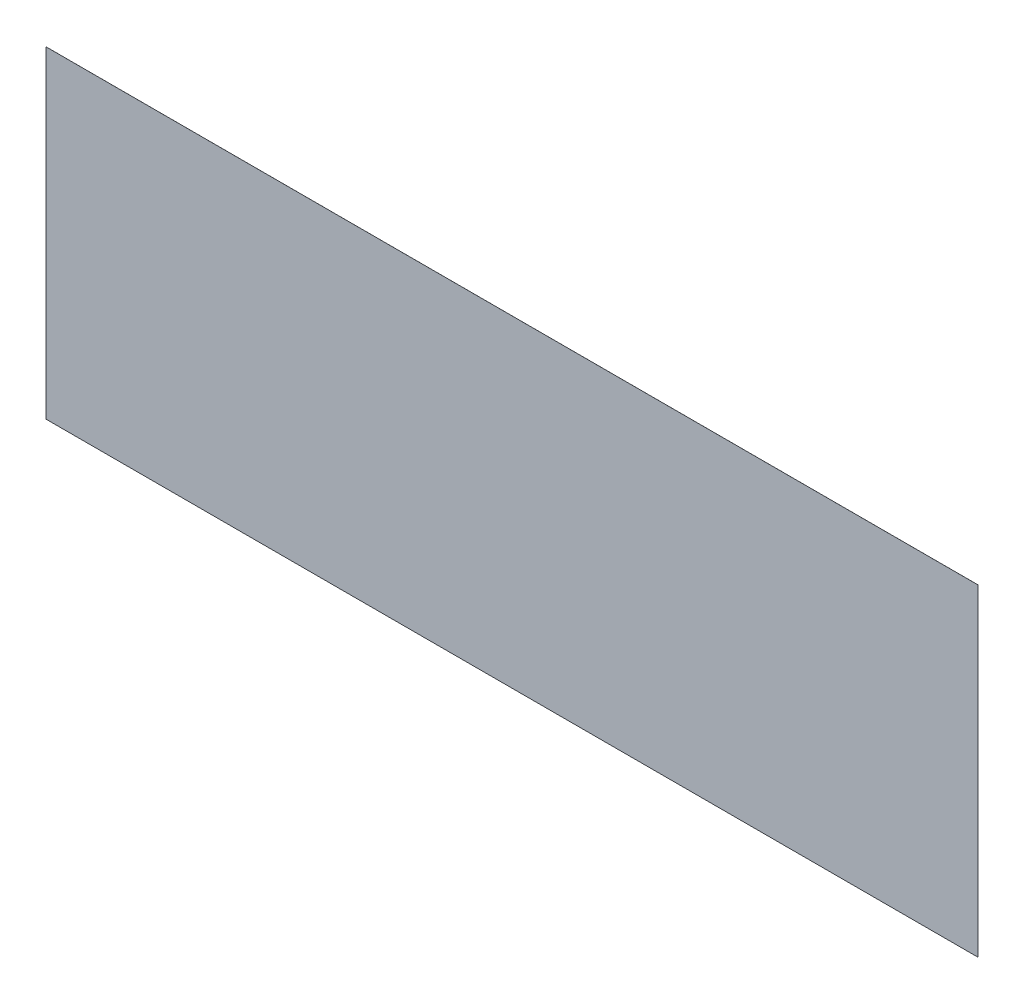
ISO-10303-21;
HEADER;
FILE_DESCRIPTION(('STEP AP214'),'2;1');
FILE_NAME('part.step','',(''),(''),'','','');
FILE_SCHEMA(('AUTOMOTIVE_DESIGN { 1 0 10303 214 1 1 1 1 }'));
ENDSEC;
DATA;
#1=APPLICATION_CONTEXT('core data for automotive mechanical design processes');
#2=APPLICATION_PROTOCOL_DEFINITION('international standard','automotive_design',2000,#1);
#3=PRODUCT_CONTEXT('',#1,'mechanical');
#4=PRODUCT('Part','Part','',(#3));
#5=PRODUCT_RELATED_PRODUCT_CATEGORY('part','',(#4));
#6=PRODUCT_DEFINITION_FORMATION('','',#4);
#7=PRODUCT_DEFINITION_CONTEXT('part definition',#1,'design');
#8=PRODUCT_DEFINITION('design','',#6,#7);
#9=PRODUCT_DEFINITION_SHAPE('','',#8);
#10=(LENGTH_UNIT() NAMED_UNIT(*) SI_UNIT(.MILLI.,.METRE.));
#11=(NAMED_UNIT(*) PLANE_ANGLE_UNIT() SI_UNIT($,.RADIAN.));
#12=(NAMED_UNIT(*) SI_UNIT($,.STERADIAN.) SOLID_ANGLE_UNIT());
#13=UNCERTAINTY_MEASURE_WITH_UNIT(LENGTH_MEASURE(1.E-05),#10,'distance_accuracy_value','');
#14=(GEOMETRIC_REPRESENTATION_CONTEXT(3) GLOBAL_UNCERTAINTY_ASSIGNED_CONTEXT((#13)) GLOBAL_UNIT_ASSIGNED_CONTEXT((#10,
#11,#12)) REPRESENTATION_CONTEXT('',''));
#15=CARTESIAN_POINT('',(0.,0.,0.));
#16=DIRECTION('',(0.,0.,1.));
#17=DIRECTION('',(1.,0.,0.));
#18=AXIS2_PLACEMENT_3D('',#15,#16,#17);
#19=CARTESIAN_POINT('',(0.,0.,0.1));
#20=DIRECTION('',(1.,0.,0.));
#21=DIRECTION('',(0.,1.,0.));
#22=AXIS2_PLACEMENT_3D('',#19,#20,#21);
#23=PLANE('',#22);
#24=DIRECTION('',(0.,-1.,0.));
#25=VECTOR('',#24,1.);
#26=CARTESIAN_POINT('',(0.,0.,0.));
#27=LINE('',#26,#25);
#28=CARTESIAN_POINT('',(0.,0.,0.));
#29=VERTEX_POINT('',#28);
#30=CARTESIAN_POINT('',(1.22464679914735E-13,-1000.,0.));
#31=VERTEX_POINT('',#30);
#32=EDGE_CURVE('E107',#29,#31,#27,.T.);
#33=ORIENTED_EDGE('',*,*,#32,.T.);
#34=DIRECTION('',(0.,0.,-1.));
#35=VECTOR('',#34,1.);
#36=CARTESIAN_POINT('',(1.22464679914735E-13,-1000.,0.1));
#37=LINE('',#36,#35);
#38=CARTESIAN_POINT('',(1.22464679914735E-13,-1000.,0.1));
#39=VERTEX_POINT('',#38);
#40=EDGE_CURVE('E11',#39,#31,#37,.T.);
#41=ORIENTED_EDGE('',*,*,#40,.F.);
#42=DIRECTION('',(0.,-1.,0.));
#43=VECTOR('',#42,1.);
#44=CARTESIAN_POINT('',(0.,0.,0.1));
#45=LINE('',#44,#43);
#46=CARTESIAN_POINT('',(0.,0.,0.1));
#47=VERTEX_POINT('',#46);
#48=EDGE_CURVE('E91',#47,#39,#45,.T.);
#49=ORIENTED_EDGE('',*,*,#48,.F.);
#50=DIRECTION('',(0.,0.,-1.));
#51=VECTOR('',#50,1.);
#52=CARTESIAN_POINT('',(0.,0.,0.1));
#53=LINE('',#52,#51);
#54=EDGE_CURVE('E103',#47,#29,#53,.T.);
#55=ORIENTED_EDGE('',*,*,#54,.T.);
#56=EDGE_LOOP('',(#33,#41,#49,#55));
#57=FACE_BOUND('',#56,.T.);
#58=ADVANCED_FACE('F39',(#57),#23,.F.);
#59=CARTESIAN_POINT('',(1.22464679914735E-13,-1000.,0.1));
#60=DIRECTION('',(0.,1.,0.));
#61=DIRECTION('',(0.,0.,1.));
#62=AXIS2_PLACEMENT_3D('',#59,#60,#61);
#63=PLANE('',#62);
#64=DIRECTION('',(1.,0.,0.));
#65=VECTOR('',#64,1.);
#66=CARTESIAN_POINT('',(1.22464679914735E-13,-1000.,0.));
#67=LINE('',#66,#65);
#68=CARTESIAN_POINT('',(2890.,-1000.,0.));
#69=VERTEX_POINT('',#68);
#70=EDGE_CURVE('E96',#31,#69,#67,.T.);
#71=ORIENTED_EDGE('',*,*,#70,.T.);
#72=DIRECTION('',(0.,0.,-1.));
#73=VECTOR('',#72,1.);
#74=CARTESIAN_POINT('',(2890.,-1000.,0.1));
#75=LINE('',#74,#73);
#76=CARTESIAN_POINT('',(2890.,-1000.,0.1));
#77=VERTEX_POINT('',#76);
#78=EDGE_CURVE('E48',#77,#69,#75,.T.);
#79=ORIENTED_EDGE('',*,*,#78,.F.);
#80=DIRECTION('',(1.,0.,0.));
#81=VECTOR('',#80,1.);
#82=CARTESIAN_POINT('',(1.22464679914735E-13,-1000.,0.1));
#83=LINE('',#82,#81);
#84=EDGE_CURVE('E86',#39,#77,#83,.T.);
#85=ORIENTED_EDGE('',*,*,#84,.F.);
#86=ORIENTED_EDGE('',*,*,#40,.T.);
#87=EDGE_LOOP('',(#71,#79,#85,#86));
#88=FACE_BOUND('',#87,.T.);
#89=ADVANCED_FACE('F95',(#88),#63,.F.);
#90=CARTESIAN_POINT('',(2890.,0.,0.1));
#91=DIRECTION('',(-1.,0.,0.));
#92=DIRECTION('',(0.,0.,1.));
#93=AXIS2_PLACEMENT_3D('',#90,#91,#92);
#94=PLANE('',#93);
#95=DIRECTION('',(0.,1.,0.));
#96=VECTOR('',#95,1.);
#97=CARTESIAN_POINT('',(2890.,0.,0.));
#98=LINE('',#97,#96);
#99=CARTESIAN_POINT('',(2890.,0.,0.));
#100=VERTEX_POINT('',#99);
#101=EDGE_CURVE('E73',#69,#100,#98,.T.);
#102=ORIENTED_EDGE('',*,*,#101,.T.);
#103=DIRECTION('',(0.,0.,-1.));
#104=VECTOR('',#103,1.);
#105=CARTESIAN_POINT('',(2890.,0.,0.1));
#106=LINE('',#105,#104);
#107=CARTESIAN_POINT('',(2890.,0.,0.1));
#108=VERTEX_POINT('',#107);
#109=EDGE_CURVE('E98',#108,#100,#106,.T.);
#110=ORIENTED_EDGE('',*,*,#109,.F.);
#111=DIRECTION('',(0.,1.,0.));
#112=VECTOR('',#111,1.);
#113=CARTESIAN_POINT('',(2890.,0.,0.1));
#114=LINE('',#113,#112);
#115=EDGE_CURVE('E89',#77,#108,#114,.T.);
#116=ORIENTED_EDGE('',*,*,#115,.F.);
#117=ORIENTED_EDGE('',*,*,#78,.T.);
#118=EDGE_LOOP('',(#102,#110,#116,#117));
#119=FACE_BOUND('',#118,.T.);
#120=ADVANCED_FACE('F99',(#119),#94,.F.);
#121=CARTESIAN_POINT('',(0.,0.,0.1));
#122=DIRECTION('',(0.,-1.,0.));
#123=DIRECTION('',(0.,0.,-1.));
#124=AXIS2_PLACEMENT_3D('',#121,#122,#123);
#125=PLANE('',#124);
#126=DIRECTION('',(-1.,0.,0.));
#127=VECTOR('',#126,1.);
#128=CARTESIAN_POINT('',(0.,0.,0.));
#129=LINE('',#128,#127);
#130=EDGE_CURVE('E79',#100,#29,#129,.T.);
#131=ORIENTED_EDGE('',*,*,#130,.T.);
#132=ORIENTED_EDGE('',*,*,#54,.F.);
#133=DIRECTION('',(-1.,0.,0.));
#134=VECTOR('',#133,1.);
#135=CARTESIAN_POINT('',(0.,0.,0.1));
#136=LINE('',#135,#134);
#137=EDGE_CURVE('E56',#108,#47,#136,.T.);
#138=ORIENTED_EDGE('',*,*,#137,.F.);
#139=ORIENTED_EDGE('',*,*,#109,.T.);
#140=EDGE_LOOP('',(#131,#132,#138,#139));
#141=FACE_BOUND('',#140,.T.);
#142=ADVANCED_FACE('F120',(#141),#125,.F.);
#143=CARTESIAN_POINT('',(0.,0.,0.1));
#144=DIRECTION('',(0.,0.,1.));
#145=DIRECTION('',(1.,0.,0.));
#146=AXIS2_PLACEMENT_3D('',#143,#144,#145);
#147=PLANE('',#146);
#148=ORIENTED_EDGE('',*,*,#48,.T.);
#149=ORIENTED_EDGE('',*,*,#84,.T.);
#150=ORIENTED_EDGE('',*,*,#115,.T.);
#151=ORIENTED_EDGE('',*,*,#137,.T.);
#152=EDGE_LOOP('',(#148,#149,#150,#151));
#153=FACE_BOUND('',#152,.T.);
#154=ADVANCED_FACE('F87',(#153),#147,.T.);
#155=CARTESIAN_POINT('',(0.,0.,0.));
#156=DIRECTION('',(0.,0.,1.));
#157=DIRECTION('',(1.,0.,0.));
#158=AXIS2_PLACEMENT_3D('',#155,#156,#157);
#159=PLANE('',#158);
#160=ORIENTED_EDGE('',*,*,#32,.F.);
#161=ORIENTED_EDGE('',*,*,#130,.F.);
#162=ORIENTED_EDGE('',*,*,#101,.F.);
#163=ORIENTED_EDGE('',*,*,#70,.F.);
#164=EDGE_LOOP('',(#160,#161,#162,#163));
#165=FACE_BOUND('',#164,.T.);
#166=ADVANCED_FACE('F123',(#165),#159,.F.);
#167=CLOSED_SHELL('',(#58,#89,#120,#142,#154,#166));
#168=MANIFOLD_SOLID_BREP('B2',#167);
#169=ADVANCED_BREP_SHAPE_REPRESENTATION('',(#18,#168),#14);
#170=SHAPE_DEFINITION_REPRESENTATION(#9,#169);
ENDSEC;
END-ISO-10303-21;
